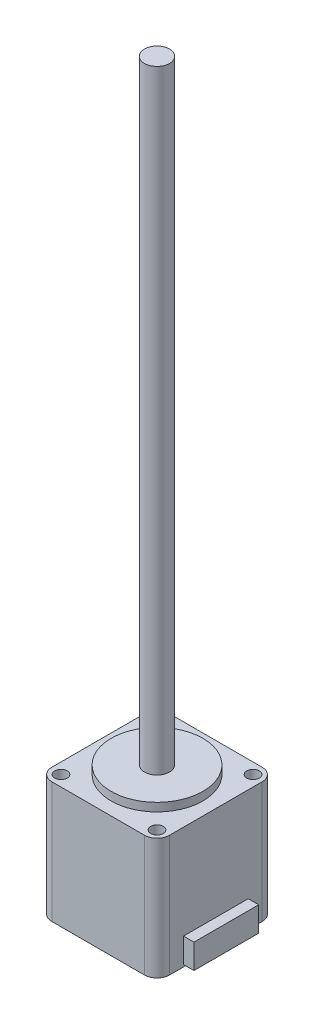
ISO-10303-21;
HEADER;
FILE_DESCRIPTION(('STEP AP214'),'2;1');
FILE_NAME('part.step','',(''),(''),'','','');
FILE_SCHEMA(('AUTOMOTIVE_DESIGN { 1 0 10303 214 1 1 1 1 }'));
ENDSEC;
DATA;
#1=APPLICATION_CONTEXT('core data for automotive mechanical design processes');
#2=APPLICATION_PROTOCOL_DEFINITION('international standard','automotive_design',2000,#1);
#3=PRODUCT_CONTEXT('',#1,'mechanical');
#4=PRODUCT('Part','Part','',(#3));
#5=PRODUCT_RELATED_PRODUCT_CATEGORY('part','',(#4));
#6=PRODUCT_DEFINITION_FORMATION('','',#4);
#7=PRODUCT_DEFINITION_CONTEXT('part definition',#1,'design');
#8=PRODUCT_DEFINITION('design','',#6,#7);
#9=PRODUCT_DEFINITION_SHAPE('','',#8);
#10=(LENGTH_UNIT() NAMED_UNIT(*) SI_UNIT(.MILLI.,.METRE.));
#11=(NAMED_UNIT(*) PLANE_ANGLE_UNIT() SI_UNIT($,.RADIAN.));
#12=(NAMED_UNIT(*) SI_UNIT($,.STERADIAN.) SOLID_ANGLE_UNIT());
#13=UNCERTAINTY_MEASURE_WITH_UNIT(LENGTH_MEASURE(1.E-05),#10,'distance_accuracy_value','');
#14=(GEOMETRIC_REPRESENTATION_CONTEXT(3) GLOBAL_UNCERTAINTY_ASSIGNED_CONTEXT((#13)) GLOBAL_UNIT_ASSIGNED_CONTEXT((#10,
#11,#12)) REPRESENTATION_CONTEXT('',''));
#15=CARTESIAN_POINT('',(0.,0.,0.));
#16=DIRECTION('',(0.,0.,1.));
#17=DIRECTION('',(1.,0.,0.));
#18=AXIS2_PLACEMENT_3D('',#15,#16,#17);
#19=CARTESIAN_POINT('',(14.1,0.,0.));
#20=DIRECTION('',(-1.,0.,0.));
#21=DIRECTION('',(0.,0.,1.));
#22=AXIS2_PLACEMENT_3D('',#19,#20,#21);
#23=PLANE('',#22);
#24=DIRECTION('',(0.,0.,-1.));
#25=VECTOR('',#24,1.);
#26=CARTESIAN_POINT('',(14.1,-29.,-14.1));
#27=LINE('',#26,#25);
#28=CARTESIAN_POINT('',(14.1,-29.,11.1));
#29=VERTEX_POINT('',#28);
#30=CARTESIAN_POINT('',(14.1,-29.,-11.1));
#31=VERTEX_POINT('',#30);
#32=EDGE_CURVE('E157',#29,#31,#27,.T.);
#33=ORIENTED_EDGE('',*,*,#32,.T.);
#34=DIRECTION('',(0.,1.,0.));
#35=VECTOR('',#34,1.);
#36=CARTESIAN_POINT('',(14.1,0.,-11.1));
#37=LINE('',#36,#35);
#38=CARTESIAN_POINT('',(14.1,0.,-11.1));
#39=VERTEX_POINT('',#38);
#40=EDGE_CURVE('E211',#31,#39,#37,.T.);
#41=ORIENTED_EDGE('',*,*,#40,.T.);
#42=DIRECTION('',(0.,0.,1.));
#43=VECTOR('',#42,1.);
#44=CARTESIAN_POINT('',(14.1,0.,14.1));
#45=LINE('',#44,#43);
#46=CARTESIAN_POINT('',(14.1,0.,11.1));
#47=VERTEX_POINT('',#46);
#48=EDGE_CURVE('E160',#39,#47,#45,.T.);
#49=ORIENTED_EDGE('',*,*,#48,.T.);
#50=DIRECTION('',(0.,-1.,0.));
#51=VECTOR('',#50,1.);
#52=CARTESIAN_POINT('',(14.1,0.,11.1));
#53=LINE('',#52,#51);
#54=EDGE_CURVE('E208',#47,#29,#53,.T.);
#55=ORIENTED_EDGE('',*,*,#54,.T.);
#56=EDGE_LOOP('',(#33,#41,#49,#55));
#57=FACE_BOUND('',#56,.T.);
#58=DIRECTION('',(0.,-1.,0.));
#59=VECTOR('',#58,1.);
#60=CARTESIAN_POINT('',(14.1,-28.5,7.75000000000001));
#61=LINE('',#60,#59);
#62=CARTESIAN_POINT('',(14.1,-22.6,7.75000000000001));
#63=VERTEX_POINT('',#62);
#64=CARTESIAN_POINT('',(14.1,-28.5,7.75000000000001));
#65=VERTEX_POINT('',#64);
#66=EDGE_CURVE('E147',#63,#65,#61,.T.);
#67=ORIENTED_EDGE('',*,*,#66,.F.);
#68=DIRECTION('',(0.,0.,1.));
#69=VECTOR('',#68,1.);
#70=CARTESIAN_POINT('',(14.1,-22.6,7.75000000000001));
#71=LINE('',#70,#69);
#72=CARTESIAN_POINT('',(14.1,-22.6,-7.75000000000001));
#73=VERTEX_POINT('',#72);
#74=EDGE_CURVE('E144',#73,#63,#71,.T.);
#75=ORIENTED_EDGE('',*,*,#74,.F.);
#76=DIRECTION('',(0.,1.,0.));
#77=VECTOR('',#76,1.);
#78=CARTESIAN_POINT('',(14.1,-28.5,-7.74999999999999));
#79=LINE('',#78,#77);
#80=CARTESIAN_POINT('',(14.1,-28.5,-7.74999999999999));
#81=VERTEX_POINT('',#80);
#82=EDGE_CURVE('E59',#81,#73,#79,.T.);
#83=ORIENTED_EDGE('',*,*,#82,.F.);
#84=DIRECTION('',(0.,0.,-1.));
#85=VECTOR('',#84,1.);
#86=CARTESIAN_POINT('',(14.1,-28.5,7.75000000000001));
#87=LINE('',#86,#85);
#88=EDGE_CURVE('E54',#65,#81,#87,.T.);
#89=ORIENTED_EDGE('',*,*,#88,.F.);
#90=EDGE_LOOP('',(#67,#75,#83,#89));
#91=FACE_BOUND('',#90,.T.);
#92=ADVANCED_FACE('F39',(#57,#91),#23,.F.);
#93=CARTESIAN_POINT('',(0.,2.,0.));
#94=DIRECTION('',(0.,-1.,0.));
#95=DIRECTION('',(0.,0.,-1.));
#96=AXIS2_PLACEMENT_3D('',#93,#94,#95);
#97=PLANE('',#96);
#98=CARTESIAN_POINT('',(0.,1.99999999999999,0.));
#99=DIRECTION('',(0.,-1.,0.));
#100=DIRECTION('',(0.,0.,-1.));
#101=AXIS2_PLACEMENT_3D('',#98,#99,#100);
#102=CIRCLE('',#101,3.);
#103=CARTESIAN_POINT('',(0.,1.99999999999999,-3.));
#104=VERTEX_POINT('',#103);
#105=EDGE_CURVE('E478',#104,#104,#102,.T.);
#106=ORIENTED_EDGE('',*,*,#105,.T.);
#107=EDGE_LOOP('',(#106));
#108=FACE_BOUND('',#107,.T.);
#109=CARTESIAN_POINT('',(0.,1.99999999999999,0.));
#110=DIRECTION('',(0.,-1.,0.));
#111=DIRECTION('',(0.,0.,-1.));
#112=AXIS2_PLACEMENT_3D('',#109,#110,#111);
#113=CIRCLE('',#112,11.);
#114=CARTESIAN_POINT('',(0.,1.99999999999999,-11.));
#115=VERTEX_POINT('',#114);
#116=EDGE_CURVE('E180',#115,#115,#113,.T.);
#117=ORIENTED_EDGE('',*,*,#116,.F.);
#118=EDGE_LOOP('',(#117));
#119=FACE_BOUND('',#118,.T.);
#120=ADVANCED_FACE('F260',(#108,#119),#97,.F.);
#121=CARTESIAN_POINT('',(0.,-54.2812497335225,0.));
#122=DIRECTION('',(0.,-1.,0.));
#123=DIRECTION('',(0.,0.,-1.));
#124=AXIS2_PLACEMENT_3D('',#121,#122,#123);
#125=CYLINDRICAL_SURFACE('',#124,11.);
#126=CARTESIAN_POINT('',(0.,0.,0.));
#127=DIRECTION('',(0.,-1.,0.));
#128=DIRECTION('',(0.,0.,-1.));
#129=AXIS2_PLACEMENT_3D('',#126,#127,#128);
#130=CIRCLE('',#129,11.);
#131=CARTESIAN_POINT('',(0.,0.,-11.));
#132=VERTEX_POINT('',#131);
#133=EDGE_CURVE('E177',#132,#132,#130,.T.);
#134=ORIENTED_EDGE('',*,*,#133,.F.);
#135=EDGE_LOOP('',(#134));
#136=FACE_BOUND('',#135,.T.);
#137=ORIENTED_EDGE('',*,*,#116,.T.);
#138=EDGE_LOOP('',(#137));
#139=FACE_BOUND('',#138,.T.);
#140=ADVANCED_FACE('F265',(#136,#139),#125,.T.);
#141=CARTESIAN_POINT('',(14.1,-29.,14.1));
#142=DIRECTION('',(0.,0.,-1.));
#143=DIRECTION('',(-1.,0.,0.));
#144=AXIS2_PLACEMENT_3D('',#141,#142,#143);
#145=PLANE('',#144);
#146=DIRECTION('',(-1.,0.,0.));
#147=VECTOR('',#146,1.);
#148=CARTESIAN_POINT('',(14.1,-29.,14.1));
#149=LINE('',#148,#147);
#150=CARTESIAN_POINT('',(11.1,-29.,14.1));
#151=VERTEX_POINT('',#150);
#152=CARTESIAN_POINT('',(-11.1,-29.,14.1));
#153=VERTEX_POINT('',#152);
#154=EDGE_CURVE('E174',#151,#153,#149,.T.);
#155=ORIENTED_EDGE('',*,*,#154,.F.);
#156=DIRECTION('',(0.,-1.,0.));
#157=VECTOR('',#156,1.);
#158=CARTESIAN_POINT('',(11.1,-29.,14.1));
#159=LINE('',#158,#157);
#160=CARTESIAN_POINT('',(11.1,0.,14.1));
#161=VERTEX_POINT('',#160);
#162=EDGE_CURVE('E11',#151,#161,#159,.F.);
#163=ORIENTED_EDGE('',*,*,#162,.T.);
#164=DIRECTION('',(-1.,0.,0.));
#165=VECTOR('',#164,1.);
#166=CARTESIAN_POINT('',(14.1,0.,14.1));
#167=LINE('',#166,#165);
#168=CARTESIAN_POINT('',(-11.1,0.,14.1));
#169=VERTEX_POINT('',#168);
#170=EDGE_CURVE('E162',#161,#169,#167,.T.);
#171=ORIENTED_EDGE('',*,*,#170,.T.);
#172=DIRECTION('',(0.,-1.,0.));
#173=VECTOR('',#172,1.);
#174=CARTESIAN_POINT('',(-11.1,-29.,14.1));
#175=LINE('',#174,#173);
#176=EDGE_CURVE('E47',#169,#153,#175,.T.);
#177=ORIENTED_EDGE('',*,*,#176,.T.);
#178=EDGE_LOOP('',(#155,#163,#171,#177));
#179=FACE_BOUND('',#178,.T.);
#180=ADVANCED_FACE('F217',(#179),#145,.F.);
#181=CARTESIAN_POINT('',(14.1,-29.,-14.1));
#182=DIRECTION('',(0.,1.,0.));
#183=DIRECTION('',(0.,0.,1.));
#184=AXIS2_PLACEMENT_3D('',#181,#182,#183);
#185=PLANE('',#184);
#186=CARTESIAN_POINT('',(11.5,-29.,-11.5));
#187=DIRECTION('',(0.,1.,0.));
#188=DIRECTION('',(0.,0.,1.));
#189=AXIS2_PLACEMENT_3D('',#186,#187,#188);
#190=CIRCLE('',#189,1.5);
#191=CARTESIAN_POINT('',(11.5,-29.,-10.));
#192=VERTEX_POINT('',#191);
#193=EDGE_CURVE('E459',#192,#192,#190,.F.);
#194=ORIENTED_EDGE('',*,*,#193,.F.);
#195=EDGE_LOOP('',(#194));
#196=FACE_BOUND('',#195,.T.);
#197=CARTESIAN_POINT('',(11.5,-29.,11.5));
#198=DIRECTION('',(0.,1.,0.));
#199=DIRECTION('',(0.,0.,1.));
#200=AXIS2_PLACEMENT_3D('',#197,#198,#199);
#201=CIRCLE('',#200,1.5);
#202=CARTESIAN_POINT('',(11.5,-29.,13.));
#203=VERTEX_POINT('',#202);
#204=EDGE_CURVE('E463',#203,#203,#201,.F.);
#205=ORIENTED_EDGE('',*,*,#204,.F.);
#206=EDGE_LOOP('',(#205));
#207=FACE_BOUND('',#206,.T.);
#208=CARTESIAN_POINT('',(-11.5,-29.,11.5));
#209=DIRECTION('',(0.,1.,0.));
#210=DIRECTION('',(0.,0.,1.));
#211=AXIS2_PLACEMENT_3D('',#208,#209,#210);
#212=CIRCLE('',#211,1.5);
#213=CARTESIAN_POINT('',(-11.5,-29.,13.));
#214=VERTEX_POINT('',#213);
#215=EDGE_CURVE('E472',#214,#214,#212,.F.);
#216=ORIENTED_EDGE('',*,*,#215,.F.);
#217=EDGE_LOOP('',(#216));
#218=FACE_BOUND('',#217,.T.);
#219=CARTESIAN_POINT('',(-11.5,-29.,-11.5));
#220=DIRECTION('',(0.,1.,0.));
#221=DIRECTION('',(0.,0.,1.));
#222=AXIS2_PLACEMENT_3D('',#219,#220,#221);
#223=CIRCLE('',#222,1.5);
#224=CARTESIAN_POINT('',(-11.5,-29.,-10.));
#225=VERTEX_POINT('',#224);
#226=EDGE_CURVE('E471',#225,#225,#223,.F.);
#227=ORIENTED_EDGE('',*,*,#226,.F.);
#228=EDGE_LOOP('',(#227));
#229=FACE_BOUND('',#228,.T.);
#230=DIRECTION('',(0.,0.,-1.));
#231=VECTOR('',#230,1.);
#232=CARTESIAN_POINT('',(-14.1,-29.,-14.1));
#233=LINE('',#232,#231);
#234=CARTESIAN_POINT('',(-14.1,-29.,11.1));
#235=VERTEX_POINT('',#234);
#236=CARTESIAN_POINT('',(-14.1,-29.,-11.1));
#237=VERTEX_POINT('',#236);
#238=EDGE_CURVE('E148',#235,#237,#233,.T.);
#239=ORIENTED_EDGE('',*,*,#238,.T.);
#240=CARTESIAN_POINT('',(-11.1,-29.,-11.1));
#241=DIRECTION('',(0.,1.,0.));
#242=DIRECTION('',(0.,0.,1.));
#243=AXIS2_PLACEMENT_3D('',#240,#241,#242);
#244=CIRCLE('',#243,3.);
#245=CARTESIAN_POINT('',(-11.1,-29.,-14.1));
#246=VERTEX_POINT('',#245);
#247=EDGE_CURVE('E206',#237,#246,#244,.F.);
#248=ORIENTED_EDGE('',*,*,#247,.T.);
#249=DIRECTION('',(-1.,0.,0.));
#250=VECTOR('',#249,1.);
#251=CARTESIAN_POINT('',(14.1,-29.,-14.1));
#252=LINE('',#251,#250);
#253=CARTESIAN_POINT('',(11.1,-29.,-14.1));
#254=VERTEX_POINT('',#253);
#255=EDGE_CURVE('E171',#254,#246,#252,.T.);
#256=ORIENTED_EDGE('',*,*,#255,.F.);
#257=CARTESIAN_POINT('',(11.1,-29.,-11.1));
#258=DIRECTION('',(0.,1.,0.));
#259=DIRECTION('',(0.,0.,1.));
#260=AXIS2_PLACEMENT_3D('',#257,#258,#259);
#261=CIRCLE('',#260,3.);
#262=EDGE_CURVE('E204',#254,#31,#261,.F.);
#263=ORIENTED_EDGE('',*,*,#262,.T.);
#264=ORIENTED_EDGE('',*,*,#32,.F.);
#265=CARTESIAN_POINT('',(11.1,-29.,11.1));
#266=DIRECTION('',(0.,1.,0.));
#267=DIRECTION('',(0.,0.,1.));
#268=AXIS2_PLACEMENT_3D('',#265,#266,#267);
#269=CIRCLE('',#268,3.);
#270=EDGE_CURVE('E202',#29,#151,#269,.F.);
#271=ORIENTED_EDGE('',*,*,#270,.T.);
#272=ORIENTED_EDGE('',*,*,#154,.T.);
#273=CARTESIAN_POINT('',(-11.1,-29.,11.1));
#274=DIRECTION('',(0.,1.,0.));
#275=DIRECTION('',(0.,0.,1.));
#276=AXIS2_PLACEMENT_3D('',#273,#274,#275);
#277=CIRCLE('',#276,3.);
#278=EDGE_CURVE('E200',#153,#235,#277,.F.);
#279=ORIENTED_EDGE('',*,*,#278,.T.);
#280=EDGE_LOOP('',(#239,#248,#256,#263,#264,#271,#272,#279));
#281=FACE_BOUND('',#280,.T.);
#282=ADVANCED_FACE('F223',(#196,#207,#218,#229,#281),#185,.F.);
#283=CARTESIAN_POINT('',(14.1,0.,-14.1));
#284=DIRECTION('',(0.,0.,1.));
#285=DIRECTION('',(1.,0.,0.));
#286=AXIS2_PLACEMENT_3D('',#283,#284,#285);
#287=PLANE('',#286);
#288=ORIENTED_EDGE('',*,*,#255,.T.);
#289=DIRECTION('',(0.,1.,0.));
#290=VECTOR('',#289,1.);
#291=CARTESIAN_POINT('',(-11.1,0.,-14.1));
#292=LINE('',#291,#290);
#293=CARTESIAN_POINT('',(-11.1,0.,-14.1));
#294=VERTEX_POINT('',#293);
#295=EDGE_CURVE('E185',#246,#294,#292,.T.);
#296=ORIENTED_EDGE('',*,*,#295,.T.);
#297=DIRECTION('',(-1.,0.,0.));
#298=VECTOR('',#297,1.);
#299=CARTESIAN_POINT('',(14.1,0.,-14.1));
#300=LINE('',#299,#298);
#301=CARTESIAN_POINT('',(11.1,0.,-14.1));
#302=VERTEX_POINT('',#301);
#303=EDGE_CURVE('E168',#302,#294,#300,.T.);
#304=ORIENTED_EDGE('',*,*,#303,.F.);
#305=DIRECTION('',(0.,1.,0.));
#306=VECTOR('',#305,1.);
#307=CARTESIAN_POINT('',(11.1,0.,-14.1));
#308=LINE('',#307,#306);
#309=EDGE_CURVE('E183',#302,#254,#308,.F.);
#310=ORIENTED_EDGE('',*,*,#309,.T.);
#311=EDGE_LOOP('',(#288,#296,#304,#310));
#312=FACE_BOUND('',#311,.T.);
#313=ADVANCED_FACE('F247',(#312),#287,.F.);
#314=CARTESIAN_POINT('',(14.1,0.,14.1));
#315=DIRECTION('',(0.,-1.,0.));
#316=DIRECTION('',(0.,0.,-1.));
#317=AXIS2_PLACEMENT_3D('',#314,#315,#316);
#318=PLANE('',#317);
#319=CARTESIAN_POINT('',(11.5,0.,-11.5));
#320=DIRECTION('',(0.,1.,0.));
#321=DIRECTION('',(0.,0.,1.));
#322=AXIS2_PLACEMENT_3D('',#319,#320,#321);
#323=CIRCLE('',#322,1.5);
#324=CARTESIAN_POINT('',(11.5,0.,-10.));
#325=VERTEX_POINT('',#324);
#326=EDGE_CURVE('E456',#325,#325,#323,.T.);
#327=ORIENTED_EDGE('',*,*,#326,.F.);
#328=EDGE_LOOP('',(#327));
#329=FACE_BOUND('',#328,.T.);
#330=CARTESIAN_POINT('',(11.5,0.,11.5));
#331=DIRECTION('',(0.,1.,0.));
#332=DIRECTION('',(0.,0.,1.));
#333=AXIS2_PLACEMENT_3D('',#330,#331,#332);
#334=CIRCLE('',#333,1.5);
#335=CARTESIAN_POINT('',(11.5,0.,13.));
#336=VERTEX_POINT('',#335);
#337=EDGE_CURVE('E460',#336,#336,#334,.T.);
#338=ORIENTED_EDGE('',*,*,#337,.F.);
#339=EDGE_LOOP('',(#338));
#340=FACE_BOUND('',#339,.T.);
#341=CARTESIAN_POINT('',(-11.5,0.,11.5));
#342=DIRECTION('',(0.,1.,0.));
#343=DIRECTION('',(0.,0.,1.));
#344=AXIS2_PLACEMENT_3D('',#341,#342,#343);
#345=CIRCLE('',#344,1.5);
#346=CARTESIAN_POINT('',(-11.5,0.,13.));
#347=VERTEX_POINT('',#346);
#348=EDGE_CURVE('E499',#347,#347,#345,.T.);
#349=ORIENTED_EDGE('',*,*,#348,.F.);
#350=EDGE_LOOP('',(#349));
#351=FACE_BOUND('',#350,.T.);
#352=CARTESIAN_POINT('',(-11.5,0.,-11.5));
#353=DIRECTION('',(0.,1.,0.));
#354=DIRECTION('',(0.,0.,1.));
#355=AXIS2_PLACEMENT_3D('',#352,#353,#354);
#356=CIRCLE('',#355,1.5);
#357=CARTESIAN_POINT('',(-11.5,0.,-10.));
#358=VERTEX_POINT('',#357);
#359=EDGE_CURVE('E468',#358,#358,#356,.T.);
#360=ORIENTED_EDGE('',*,*,#359,.F.);
#361=EDGE_LOOP('',(#360));
#362=FACE_BOUND('',#361,.T.);
#363=ORIENTED_EDGE('',*,*,#133,.T.);
#364=EDGE_LOOP('',(#363));
#365=FACE_BOUND('',#364,.T.);
#366=ORIENTED_EDGE('',*,*,#303,.T.);
#367=CARTESIAN_POINT('',(-11.1,0.,-11.1));
#368=DIRECTION('',(0.,-1.,0.));
#369=DIRECTION('',(0.,0.,-1.));
#370=AXIS2_PLACEMENT_3D('',#367,#368,#369);
#371=CIRCLE('',#370,3.);
#372=CARTESIAN_POINT('',(-14.1,0.,-11.1));
#373=VERTEX_POINT('',#372);
#374=EDGE_CURVE('E194',#294,#373,#371,.F.);
#375=ORIENTED_EDGE('',*,*,#374,.T.);
#376=DIRECTION('',(0.,0.,1.));
#377=VECTOR('',#376,1.);
#378=CARTESIAN_POINT('',(-14.1,0.,14.1));
#379=LINE('',#378,#377);
#380=CARTESIAN_POINT('',(-14.1,0.,11.1));
#381=VERTEX_POINT('',#380);
#382=EDGE_CURVE('E151',#373,#381,#379,.T.);
#383=ORIENTED_EDGE('',*,*,#382,.T.);
#384=CARTESIAN_POINT('',(-11.1,0.,11.1));
#385=DIRECTION('',(0.,-1.,0.));
#386=DIRECTION('',(0.,0.,-1.));
#387=AXIS2_PLACEMENT_3D('',#384,#385,#386);
#388=CIRCLE('',#387,3.);
#389=EDGE_CURVE('E188',#381,#169,#388,.F.);
#390=ORIENTED_EDGE('',*,*,#389,.T.);
#391=ORIENTED_EDGE('',*,*,#170,.F.);
#392=CARTESIAN_POINT('',(11.1,0.,11.1));
#393=DIRECTION('',(0.,-1.,0.));
#394=DIRECTION('',(0.,0.,-1.));
#395=AXIS2_PLACEMENT_3D('',#392,#393,#394);
#396=CIRCLE('',#395,3.);
#397=EDGE_CURVE('E190',#161,#47,#396,.F.);
#398=ORIENTED_EDGE('',*,*,#397,.T.);
#399=ORIENTED_EDGE('',*,*,#48,.F.);
#400=CARTESIAN_POINT('',(11.1,0.,-11.1));
#401=DIRECTION('',(0.,-1.,0.));
#402=DIRECTION('',(0.,0.,-1.));
#403=AXIS2_PLACEMENT_3D('',#400,#401,#402);
#404=CIRCLE('',#403,3.);
#405=EDGE_CURVE('E192',#39,#302,#404,.F.);
#406=ORIENTED_EDGE('',*,*,#405,.T.);
#407=EDGE_LOOP('',(#366,#375,#383,#390,#391,#398,#399,#406));
#408=FACE_BOUND('',#407,.T.);
#409=ADVANCED_FACE('F234',(#329,#340,#351,#362,#365,#408),#318,.F.);
#410=CARTESIAN_POINT('',(-14.1,0.,0.));
#411=DIRECTION('',(-1.,0.,0.));
#412=DIRECTION('',(0.,0.,1.));
#413=AXIS2_PLACEMENT_3D('',#410,#411,#412);
#414=PLANE('',#413);
#415=ORIENTED_EDGE('',*,*,#382,.F.);
#416=DIRECTION('',(0.,1.,0.));
#417=VECTOR('',#416,1.);
#418=CARTESIAN_POINT('',(-14.1,-29.,-11.1));
#419=LINE('',#418,#417);
#420=EDGE_CURVE('E198',#373,#237,#419,.F.);
#421=ORIENTED_EDGE('',*,*,#420,.T.);
#422=ORIENTED_EDGE('',*,*,#238,.F.);
#423=DIRECTION('',(0.,-1.,0.));
#424=VECTOR('',#423,1.);
#425=CARTESIAN_POINT('',(-14.1,0.,11.1));
#426=LINE('',#425,#424);
#427=EDGE_CURVE('E196',#235,#381,#426,.F.);
#428=ORIENTED_EDGE('',*,*,#427,.T.);
#429=EDGE_LOOP('',(#415,#421,#422,#428));
#430=FACE_BOUND('',#429,.T.);
#431=ADVANCED_FACE('F239',(#430),#414,.T.);
#432=CARTESIAN_POINT('',(-11.1,0.,-11.1));
#433=DIRECTION('',(0.,-1.,0.));
#434=DIRECTION('',(0.,0.,-1.));
#435=AXIS2_PLACEMENT_3D('',#432,#433,#434);
#436=CYLINDRICAL_SURFACE('',#435,3.);
#437=ORIENTED_EDGE('',*,*,#247,.F.);
#438=ORIENTED_EDGE('',*,*,#420,.F.);
#439=ORIENTED_EDGE('',*,*,#374,.F.);
#440=ORIENTED_EDGE('',*,*,#295,.F.);
#441=EDGE_LOOP('',(#437,#438,#439,#440));
#442=FACE_BOUND('',#441,.T.);
#443=ADVANCED_FACE('F245',(#442),#436,.T.);
#444=CARTESIAN_POINT('',(11.1,0.,-11.1));
#445=DIRECTION('',(0.,1.,0.));
#446=DIRECTION('',(0.,0.,1.));
#447=AXIS2_PLACEMENT_3D('',#444,#445,#446);
#448=CYLINDRICAL_SURFACE('',#447,3.);
#449=ORIENTED_EDGE('',*,*,#262,.F.);
#450=ORIENTED_EDGE('',*,*,#309,.F.);
#451=ORIENTED_EDGE('',*,*,#405,.F.);
#452=ORIENTED_EDGE('',*,*,#40,.F.);
#453=EDGE_LOOP('',(#449,#450,#451,#452));
#454=FACE_BOUND('',#453,.T.);
#455=ADVANCED_FACE('F251',(#454),#448,.T.);
#456=CARTESIAN_POINT('',(11.1,0.,11.1));
#457=DIRECTION('',(0.,-1.,0.));
#458=DIRECTION('',(0.,0.,-1.));
#459=AXIS2_PLACEMENT_3D('',#456,#457,#458);
#460=CYLINDRICAL_SURFACE('',#459,3.);
#461=ORIENTED_EDGE('',*,*,#397,.F.);
#462=ORIENTED_EDGE('',*,*,#162,.F.);
#463=ORIENTED_EDGE('',*,*,#270,.F.);
#464=ORIENTED_EDGE('',*,*,#54,.F.);
#465=EDGE_LOOP('',(#461,#462,#463,#464));
#466=FACE_BOUND('',#465,.T.);
#467=ADVANCED_FACE('F229',(#466),#460,.T.);
#468=CARTESIAN_POINT('',(-11.1,-29.,11.1));
#469=DIRECTION('',(0.,1.,0.));
#470=DIRECTION('',(0.,0.,1.));
#471=AXIS2_PLACEMENT_3D('',#468,#469,#470);
#472=CYLINDRICAL_SURFACE('',#471,3.);
#473=ORIENTED_EDGE('',*,*,#389,.F.);
#474=ORIENTED_EDGE('',*,*,#427,.F.);
#475=ORIENTED_EDGE('',*,*,#278,.F.);
#476=ORIENTED_EDGE('',*,*,#176,.F.);
#477=EDGE_LOOP('',(#473,#474,#475,#476));
#478=FACE_BOUND('',#477,.T.);
#479=ADVANCED_FACE('F41',(#478),#472,.T.);
#480=CARTESIAN_POINT('',(16.6,-28.5,7.75000000000001));
#481=DIRECTION('',(0.,0.,-1.));
#482=DIRECTION('',(-1.,0.,0.));
#483=AXIS2_PLACEMENT_3D('',#480,#481,#482);
#484=PLANE('',#483);
#485=ORIENTED_EDGE('',*,*,#66,.T.);
#486=DIRECTION('',(-1.,0.,0.));
#487=VECTOR('',#486,1.);
#488=CARTESIAN_POINT('',(16.6,-28.5,7.75000000000001));
#489=LINE('',#488,#487);
#490=CARTESIAN_POINT('',(16.6,-28.5,7.75000000000001));
#491=VERTEX_POINT('',#490);
#492=EDGE_CURVE('E128',#491,#65,#489,.T.);
#493=ORIENTED_EDGE('',*,*,#492,.F.);
#494=DIRECTION('',(0.,-1.,0.));
#495=VECTOR('',#494,1.);
#496=CARTESIAN_POINT('',(16.6,-28.5,7.75000000000001));
#497=LINE('',#496,#495);
#498=CARTESIAN_POINT('',(16.6,-22.6,7.75000000000001));
#499=VERTEX_POINT('',#498);
#500=EDGE_CURVE('E135',#499,#491,#497,.T.);
#501=ORIENTED_EDGE('',*,*,#500,.F.);
#502=DIRECTION('',(-1.,0.,0.));
#503=VECTOR('',#502,1.);
#504=CARTESIAN_POINT('',(16.6,-22.6,7.75000000000001));
#505=LINE('',#504,#503);
#506=EDGE_CURVE('E483',#499,#63,#505,.T.);
#507=ORIENTED_EDGE('',*,*,#506,.T.);
#508=EDGE_LOOP('',(#485,#493,#501,#507));
#509=FACE_BOUND('',#508,.T.);
#510=ADVANCED_FACE('F146',(#509),#484,.F.);
#511=CARTESIAN_POINT('',(16.6,-28.5,7.75000000000001));
#512=DIRECTION('',(0.,1.,0.));
#513=DIRECTION('',(0.,0.,1.));
#514=AXIS2_PLACEMENT_3D('',#511,#512,#513);
#515=PLANE('',#514);
#516=ORIENTED_EDGE('',*,*,#88,.T.);
#517=DIRECTION('',(-1.,0.,0.));
#518=VECTOR('',#517,1.);
#519=CARTESIAN_POINT('',(16.6,-28.5,-7.74999999999999));
#520=LINE('',#519,#518);
#521=CARTESIAN_POINT('',(16.6,-28.5,-7.74999999999999));
#522=VERTEX_POINT('',#521);
#523=EDGE_CURVE('E131',#522,#81,#520,.T.);
#524=ORIENTED_EDGE('',*,*,#523,.F.);
#525=DIRECTION('',(0.,0.,-1.));
#526=VECTOR('',#525,1.);
#527=CARTESIAN_POINT('',(16.6,-28.5,7.75000000000001));
#528=LINE('',#527,#526);
#529=EDGE_CURVE('E124',#491,#522,#528,.T.);
#530=ORIENTED_EDGE('',*,*,#529,.F.);
#531=ORIENTED_EDGE('',*,*,#492,.T.);
#532=EDGE_LOOP('',(#516,#524,#530,#531));
#533=FACE_BOUND('',#532,.T.);
#534=ADVANCED_FACE('F126',(#533),#515,.F.);
#535=CARTESIAN_POINT('',(16.6,-28.5,-7.74999999999999));
#536=DIRECTION('',(0.,0.,1.));
#537=DIRECTION('',(0.,-1.,0.));
#538=AXIS2_PLACEMENT_3D('',#535,#536,#537);
#539=PLANE('',#538);
#540=ORIENTED_EDGE('',*,*,#82,.T.);
#541=DIRECTION('',(-1.,0.,0.));
#542=VECTOR('',#541,1.);
#543=CARTESIAN_POINT('',(16.6,-22.6,-7.75000000000001));
#544=LINE('',#543,#542);
#545=CARTESIAN_POINT('',(16.6,-22.6,-7.75000000000001));
#546=VERTEX_POINT('',#545);
#547=EDGE_CURVE('E153',#546,#73,#544,.T.);
#548=ORIENTED_EDGE('',*,*,#547,.F.);
#549=DIRECTION('',(0.,1.,0.));
#550=VECTOR('',#549,1.);
#551=CARTESIAN_POINT('',(16.6,-28.5,-7.74999999999999));
#552=LINE('',#551,#550);
#553=EDGE_CURVE('E134',#522,#546,#552,.T.);
#554=ORIENTED_EDGE('',*,*,#553,.F.);
#555=ORIENTED_EDGE('',*,*,#523,.T.);
#556=EDGE_LOOP('',(#540,#548,#554,#555));
#557=FACE_BOUND('',#556,.T.);
#558=ADVANCED_FACE('F361',(#557),#539,.F.);
#559=CARTESIAN_POINT('',(16.6,-22.6,7.75000000000001));
#560=DIRECTION('',(0.,-1.,0.));
#561=DIRECTION('',(0.,0.,-1.));
#562=AXIS2_PLACEMENT_3D('',#559,#560,#561);
#563=PLANE('',#562);
#564=ORIENTED_EDGE('',*,*,#74,.T.);
#565=ORIENTED_EDGE('',*,*,#506,.F.);
#566=DIRECTION('',(0.,0.,1.));
#567=VECTOR('',#566,1.);
#568=CARTESIAN_POINT('',(16.6,-22.6,7.75000000000001));
#569=LINE('',#568,#567);
#570=EDGE_CURVE('E140',#546,#499,#569,.T.);
#571=ORIENTED_EDGE('',*,*,#570,.F.);
#572=ORIENTED_EDGE('',*,*,#547,.T.);
#573=EDGE_LOOP('',(#564,#565,#571,#572));
#574=FACE_BOUND('',#573,.T.);
#575=ADVANCED_FACE('F369',(#574),#563,.F.);
#576=CARTESIAN_POINT('',(16.6,0.,0.));
#577=DIRECTION('',(-1.,0.,0.));
#578=DIRECTION('',(0.,0.,1.));
#579=AXIS2_PLACEMENT_3D('',#576,#577,#578);
#580=PLANE('',#579);
#581=ORIENTED_EDGE('',*,*,#500,.T.);
#582=ORIENTED_EDGE('',*,*,#529,.T.);
#583=ORIENTED_EDGE('',*,*,#553,.T.);
#584=ORIENTED_EDGE('',*,*,#570,.T.);
#585=EDGE_LOOP('',(#581,#582,#583,#584));
#586=FACE_BOUND('',#585,.T.);
#587=ADVANCED_FACE('F138',(#586),#580,.F.);
#588=CARTESIAN_POINT('',(0.,-54.2812497335225,0.));
#589=DIRECTION('',(0.,-1.,0.));
#590=DIRECTION('',(0.,0.,-1.));
#591=AXIS2_PLACEMENT_3D('',#588,#589,#590);
#592=CYLINDRICAL_SURFACE('',#591,3.);
#593=ORIENTED_EDGE('',*,*,#105,.F.);
#594=EDGE_LOOP('',(#593));
#595=FACE_BOUND('',#594,.T.);
#596=CARTESIAN_POINT('',(0.,149.,0.));
#597=DIRECTION('',(0.,-1.,0.));
#598=DIRECTION('',(0.,0.,-1.));
#599=AXIS2_PLACEMENT_3D('',#596,#597,#598);
#600=CIRCLE('',#599,3.);
#601=CARTESIAN_POINT('',(0.,149.,-3.));
#602=VERTEX_POINT('',#601);
#603=EDGE_CURVE('E475',#602,#602,#600,.T.);
#604=ORIENTED_EDGE('',*,*,#603,.T.);
#605=EDGE_LOOP('',(#604));
#606=FACE_BOUND('',#605,.T.);
#607=ADVANCED_FACE('F387',(#595,#606),#592,.T.);
#608=CARTESIAN_POINT('',(0.,149.,3.));
#609=DIRECTION('',(0.,-1.,0.));
#610=DIRECTION('',(0.,0.,-1.));
#611=AXIS2_PLACEMENT_3D('',#608,#609,#610);
#612=PLANE('',#611);
#613=ORIENTED_EDGE('',*,*,#603,.F.);
#614=EDGE_LOOP('',(#613));
#615=FACE_BOUND('',#614,.T.);
#616=ADVANCED_FACE('F400',(#615),#612,.F.);
#617=CARTESIAN_POINT('',(-11.5,-29.001,-11.5));
#618=DIRECTION('',(0.,1.,0.));
#619=DIRECTION('',(0.,0.,1.));
#620=AXIS2_PLACEMENT_3D('',#617,#618,#619);
#621=CYLINDRICAL_SURFACE('',#620,1.5);
#622=ORIENTED_EDGE('',*,*,#359,.T.);
#623=EDGE_LOOP('',(#622));
#624=FACE_BOUND('',#623,.T.);
#625=ORIENTED_EDGE('',*,*,#226,.T.);
#626=EDGE_LOOP('',(#625));
#627=FACE_BOUND('',#626,.T.);
#628=ADVANCED_FACE('F409',(#624,#627),#621,.F.);
#629=CARTESIAN_POINT('',(-11.5,-29.001,11.5));
#630=DIRECTION('',(0.,1.,0.));
#631=DIRECTION('',(0.,0.,1.));
#632=AXIS2_PLACEMENT_3D('',#629,#630,#631);
#633=CYLINDRICAL_SURFACE('',#632,1.5);
#634=ORIENTED_EDGE('',*,*,#348,.T.);
#635=EDGE_LOOP('',(#634));
#636=FACE_BOUND('',#635,.T.);
#637=ORIENTED_EDGE('',*,*,#215,.T.);
#638=EDGE_LOOP('',(#637));
#639=FACE_BOUND('',#638,.T.);
#640=ADVANCED_FACE('F419',(#636,#639),#633,.F.);
#641=CARTESIAN_POINT('',(11.5,-29.001,11.5));
#642=DIRECTION('',(0.,1.,0.));
#643=DIRECTION('',(0.,0.,1.));
#644=AXIS2_PLACEMENT_3D('',#641,#642,#643);
#645=CYLINDRICAL_SURFACE('',#644,1.5);
#646=ORIENTED_EDGE('',*,*,#337,.T.);
#647=EDGE_LOOP('',(#646));
#648=FACE_BOUND('',#647,.T.);
#649=ORIENTED_EDGE('',*,*,#204,.T.);
#650=EDGE_LOOP('',(#649));
#651=FACE_BOUND('',#650,.T.);
#652=ADVANCED_FACE('F426',(#648,#651),#645,.F.);
#653=CARTESIAN_POINT('',(11.5,-29.001,-11.5));
#654=DIRECTION('',(0.,1.,0.));
#655=DIRECTION('',(0.,0.,1.));
#656=AXIS2_PLACEMENT_3D('',#653,#654,#655);
#657=CYLINDRICAL_SURFACE('',#656,1.5);
#658=ORIENTED_EDGE('',*,*,#326,.T.);
#659=EDGE_LOOP('',(#658));
#660=FACE_BOUND('',#659,.T.);
#661=ORIENTED_EDGE('',*,*,#193,.T.);
#662=EDGE_LOOP('',(#661));
#663=FACE_BOUND('',#662,.T.);
#664=ADVANCED_FACE('F434',(#660,#663),#657,.F.);
#665=CLOSED_SHELL('',(#92,#120,#140,#180,#282,#313,#409,#431,#443,#455,#467,#479,#510,#534,#558,
#575,#587,#607,#616,#628,#640,#652,#664));
#666=MANIFOLD_SOLID_BREP('B2',#665);
#667=ADVANCED_BREP_SHAPE_REPRESENTATION('',(#18,#666),#14);
#668=SHAPE_DEFINITION_REPRESENTATION(#9,#667);
ENDSEC;
END-ISO-10303-21;
